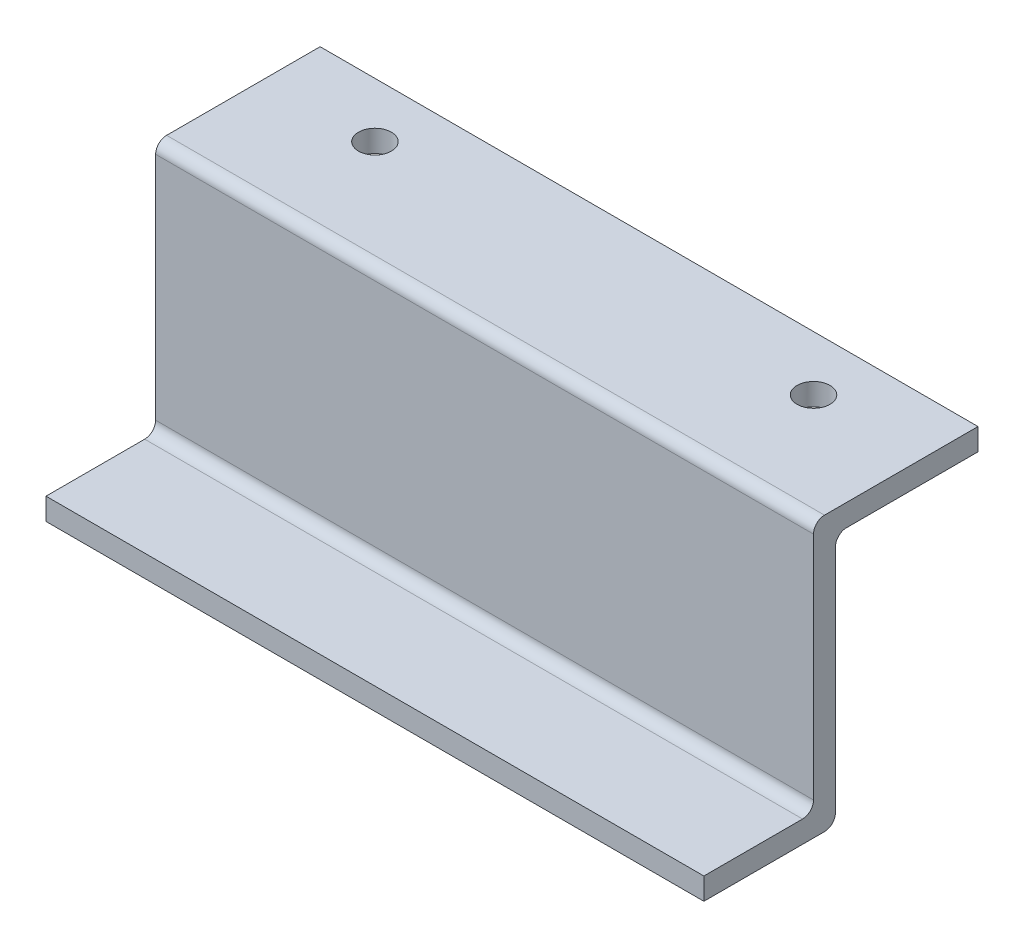
ISO-10303-21;
HEADER;
FILE_DESCRIPTION(('STEP AP214'),'2;1');
FILE_NAME('part.step','',(''),(''),'','','');
FILE_SCHEMA(('AUTOMOTIVE_DESIGN { 1 0 10303 214 1 1 1 1 }'));
ENDSEC;
DATA;
#1=APPLICATION_CONTEXT('core data for automotive mechanical design processes');
#2=APPLICATION_PROTOCOL_DEFINITION('international standard','automotive_design',2000,#1);
#3=PRODUCT_CONTEXT('',#1,'mechanical');
#4=PRODUCT('Part','Part','',(#3));
#5=PRODUCT_RELATED_PRODUCT_CATEGORY('part','',(#4));
#6=PRODUCT_DEFINITION_FORMATION('','',#4);
#7=PRODUCT_DEFINITION_CONTEXT('part definition',#1,'design');
#8=PRODUCT_DEFINITION('design','',#6,#7);
#9=PRODUCT_DEFINITION_SHAPE('','',#8);
#10=(LENGTH_UNIT() NAMED_UNIT(*) SI_UNIT(.MILLI.,.METRE.));
#11=(NAMED_UNIT(*) PLANE_ANGLE_UNIT() SI_UNIT($,.RADIAN.));
#12=(NAMED_UNIT(*) SI_UNIT($,.STERADIAN.) SOLID_ANGLE_UNIT());
#13=UNCERTAINTY_MEASURE_WITH_UNIT(LENGTH_MEASURE(1.E-05),#10,'distance_accuracy_value','');
#14=(GEOMETRIC_REPRESENTATION_CONTEXT(3) GLOBAL_UNCERTAINTY_ASSIGNED_CONTEXT((#13)) GLOBAL_UNIT_ASSIGNED_CONTEXT((#10,
#11,#12)) REPRESENTATION_CONTEXT('',''));
#15=CARTESIAN_POINT('',(0.,0.,0.));
#16=DIRECTION('',(0.,0.,1.));
#17=DIRECTION('',(1.,0.,0.));
#18=AXIS2_PLACEMENT_3D('',#15,#16,#17);
#19=CARTESIAN_POINT('',(60.,0.,-25.));
#20=DIRECTION('',(0.,0.,-1.));
#21=DIRECTION('',(-1.,0.,0.));
#22=AXIS2_PLACEMENT_3D('',#19,#20,#21);
#23=PLANE('',#22);
#24=DIRECTION('',(0.,-1.,0.));
#25=VECTOR('',#24,1.);
#26=CARTESIAN_POINT('',(0.,0.,-25.));
#27=LINE('',#26,#25);
#28=CARTESIAN_POINT('',(0.,25.,-25.));
#29=VERTEX_POINT('',#28);
#30=CARTESIAN_POINT('',(0.,23.,-25.));
#31=VERTEX_POINT('',#30);
#32=EDGE_CURVE('E143',#29,#31,#27,.T.);
#33=ORIENTED_EDGE('',*,*,#32,.F.);
#34=DIRECTION('',(-1.,0.,0.));
#35=VECTOR('',#34,1.);
#36=CARTESIAN_POINT('',(60.,25.,-25.));
#37=LINE('',#36,#35);
#38=CARTESIAN_POINT('',(60.,25.,-25.));
#39=VERTEX_POINT('',#38);
#40=EDGE_CURVE('E131',#39,#29,#37,.T.);
#41=ORIENTED_EDGE('',*,*,#40,.F.);
#42=DIRECTION('',(0.,-1.,0.));
#43=VECTOR('',#42,1.);
#44=CARTESIAN_POINT('',(60.,0.,-25.));
#45=LINE('',#44,#43);
#46=CARTESIAN_POINT('',(60.,23.,-25.));
#47=VERTEX_POINT('',#46);
#48=EDGE_CURVE('E138',#39,#47,#45,.T.);
#49=ORIENTED_EDGE('',*,*,#48,.T.);
#50=DIRECTION('',(-1.,0.,0.));
#51=VECTOR('',#50,1.);
#52=CARTESIAN_POINT('',(60.,23.,-25.));
#53=LINE('',#52,#51);
#54=EDGE_CURVE('E171',#47,#31,#53,.T.);
#55=ORIENTED_EDGE('',*,*,#54,.T.);
#56=EDGE_LOOP('',(#33,#41,#49,#55));
#57=FACE_BOUND('',#56,.T.);
#58=ADVANCED_FACE('F35',(#57),#23,.T.);
#59=CARTESIAN_POINT('',(60.,25.,0.));
#60=DIRECTION('',(0.,1.,0.));
#61=DIRECTION('',(0.,0.,1.));
#62=AXIS2_PLACEMENT_3D('',#59,#60,#61);
#63=PLANE('',#62);
#64=CARTESIAN_POINT('',(10.,25.,-20.));
#65=DIRECTION('',(0.,1.,0.));
#66=DIRECTION('',(0.,0.,1.));
#67=AXIS2_PLACEMENT_3D('',#64,#65,#66);
#68=CIRCLE('',#67,1.5);
#69=CARTESIAN_POINT('',(10.,25.,-18.5));
#70=VERTEX_POINT('',#69);
#71=EDGE_CURVE('E223',#70,#70,#68,.T.);
#72=ORIENTED_EDGE('',*,*,#71,.F.);
#73=EDGE_LOOP('',(#72));
#74=FACE_BOUND('',#73,.T.);
#75=CARTESIAN_POINT('',(50.,25.,-20.));
#76=DIRECTION('',(0.,1.,0.));
#77=DIRECTION('',(0.,0.,1.));
#78=AXIS2_PLACEMENT_3D('',#75,#76,#77);
#79=CIRCLE('',#78,1.5);
#80=CARTESIAN_POINT('',(50.,25.,-18.5));
#81=VERTEX_POINT('',#80);
#82=EDGE_CURVE('E155',#81,#81,#79,.T.);
#83=ORIENTED_EDGE('',*,*,#82,.F.);
#84=EDGE_LOOP('',(#83));
#85=FACE_BOUND('',#84,.T.);
#86=DIRECTION('',(0.,0.,-1.));
#87=VECTOR('',#86,1.);
#88=CARTESIAN_POINT('',(0.,25.,0.));
#89=LINE('',#88,#87);
#90=CARTESIAN_POINT('',(0.,25.,-11.));
#91=VERTEX_POINT('',#90);
#92=EDGE_CURVE('E173',#91,#29,#89,.T.);
#93=ORIENTED_EDGE('',*,*,#92,.F.);
#94=DIRECTION('',(-1.,0.,0.));
#95=VECTOR('',#94,1.);
#96=CARTESIAN_POINT('',(60.,25.,-11.));
#97=LINE('',#96,#95);
#98=CARTESIAN_POINT('',(60.,25.,-11.));
#99=VERTEX_POINT('',#98);
#100=EDGE_CURVE('E134',#91,#99,#97,.F.);
#101=ORIENTED_EDGE('',*,*,#100,.T.);
#102=DIRECTION('',(0.,0.,-1.));
#103=VECTOR('',#102,1.);
#104=CARTESIAN_POINT('',(60.,25.,0.));
#105=LINE('',#104,#103);
#106=EDGE_CURVE('E127',#99,#39,#105,.T.);
#107=ORIENTED_EDGE('',*,*,#106,.T.);
#108=ORIENTED_EDGE('',*,*,#40,.T.);
#109=EDGE_LOOP('',(#93,#101,#107,#108));
#110=FACE_BOUND('',#109,.T.);
#111=ADVANCED_FACE('F130',(#74,#85,#110),#63,.T.);
#112=CARTESIAN_POINT('',(60.,0.,-10.));
#113=DIRECTION('',(0.,0.,1.));
#114=DIRECTION('',(1.,0.,0.));
#115=AXIS2_PLACEMENT_3D('',#112,#113,#114);
#116=PLANE('',#115);
#117=DIRECTION('',(0.,1.,0.));
#118=VECTOR('',#117,1.);
#119=CARTESIAN_POINT('',(60.,0.,-10.));
#120=LINE('',#119,#118);
#121=CARTESIAN_POINT('',(60.,3.,-10.));
#122=VERTEX_POINT('',#121);
#123=CARTESIAN_POINT('',(60.,24.,-10.));
#124=VERTEX_POINT('',#123);
#125=EDGE_CURVE('E137',#122,#124,#120,.T.);
#126=ORIENTED_EDGE('',*,*,#125,.T.);
#127=DIRECTION('',(-1.,0.,0.));
#128=VECTOR('',#127,1.);
#129=CARTESIAN_POINT('',(60.,24.,-10.));
#130=LINE('',#129,#128);
#131=CARTESIAN_POINT('',(0.,24.,-10.));
#132=VERTEX_POINT('',#131);
#133=EDGE_CURVE('E194',#124,#132,#130,.T.);
#134=ORIENTED_EDGE('',*,*,#133,.T.);
#135=DIRECTION('',(0.,1.,0.));
#136=VECTOR('',#135,1.);
#137=CARTESIAN_POINT('',(0.,0.,-10.));
#138=LINE('',#137,#136);
#139=CARTESIAN_POINT('',(0.,3.,-10.));
#140=VERTEX_POINT('',#139);
#141=EDGE_CURVE('E175',#140,#132,#138,.T.);
#142=ORIENTED_EDGE('',*,*,#141,.F.);
#143=DIRECTION('',(-1.,0.,0.));
#144=VECTOR('',#143,1.);
#145=CARTESIAN_POINT('',(60.,3.,-10.));
#146=LINE('',#145,#144);
#147=EDGE_CURVE('E144',#140,#122,#146,.F.);
#148=ORIENTED_EDGE('',*,*,#147,.T.);
#149=EDGE_LOOP('',(#126,#134,#142,#148));
#150=FACE_BOUND('',#149,.T.);
#151=ADVANCED_FACE('F236',(#150),#116,.T.);
#152=CARTESIAN_POINT('',(60.,2.,0.));
#153=DIRECTION('',(0.,1.,0.));
#154=DIRECTION('',(0.,0.,1.));
#155=AXIS2_PLACEMENT_3D('',#152,#153,#154);
#156=PLANE('',#155);
#157=DIRECTION('',(0.,0.,-1.));
#158=VECTOR('',#157,1.);
#159=CARTESIAN_POINT('',(60.,2.,0.));
#160=LINE('',#159,#158);
#161=CARTESIAN_POINT('',(60.,2.,0.));
#162=VERTEX_POINT('',#161);
#163=CARTESIAN_POINT('',(60.,2.,-9.));
#164=VERTEX_POINT('',#163);
#165=EDGE_CURVE('E160',#162,#164,#160,.T.);
#166=ORIENTED_EDGE('',*,*,#165,.T.);
#167=DIRECTION('',(-1.,0.,0.));
#168=VECTOR('',#167,1.);
#169=CARTESIAN_POINT('',(0.,2.,-9.));
#170=LINE('',#169,#168);
#171=CARTESIAN_POINT('',(0.,2.,-9.));
#172=VERTEX_POINT('',#171);
#173=EDGE_CURVE('E215',#164,#172,#170,.T.);
#174=ORIENTED_EDGE('',*,*,#173,.T.);
#175=DIRECTION('',(0.,0.,-1.));
#176=VECTOR('',#175,1.);
#177=CARTESIAN_POINT('',(0.,2.,0.));
#178=LINE('',#177,#176);
#179=CARTESIAN_POINT('',(0.,2.,0.));
#180=VERTEX_POINT('',#179);
#181=EDGE_CURVE('E178',#180,#172,#178,.T.);
#182=ORIENTED_EDGE('',*,*,#181,.F.);
#183=DIRECTION('',(-1.,0.,0.));
#184=VECTOR('',#183,1.);
#185=CARTESIAN_POINT('',(60.,2.,0.));
#186=LINE('',#185,#184);
#187=EDGE_CURVE('E145',#162,#180,#186,.T.);
#188=ORIENTED_EDGE('',*,*,#187,.F.);
#189=EDGE_LOOP('',(#166,#174,#182,#188));
#190=FACE_BOUND('',#189,.T.);
#191=ADVANCED_FACE('F243',(#190),#156,.T.);
#192=CARTESIAN_POINT('',(60.,0.,0.));
#193=DIRECTION('',(0.,0.,1.));
#194=DIRECTION('',(1.,0.,0.));
#195=AXIS2_PLACEMENT_3D('',#192,#193,#194);
#196=PLANE('',#195);
#197=DIRECTION('',(0.,1.,0.));
#198=VECTOR('',#197,1.);
#199=CARTESIAN_POINT('',(0.,0.,0.));
#200=LINE('',#199,#198);
#201=CARTESIAN_POINT('',(0.,0.,0.));
#202=VERTEX_POINT('',#201);
#203=EDGE_CURVE('E181',#202,#180,#200,.T.);
#204=ORIENTED_EDGE('',*,*,#203,.F.);
#205=DIRECTION('',(-1.,0.,0.));
#206=VECTOR('',#205,1.);
#207=CARTESIAN_POINT('',(60.,0.,0.));
#208=LINE('',#207,#206);
#209=CARTESIAN_POINT('',(60.,0.,0.));
#210=VERTEX_POINT('',#209);
#211=EDGE_CURVE('E190',#210,#202,#208,.T.);
#212=ORIENTED_EDGE('',*,*,#211,.F.);
#213=DIRECTION('',(0.,1.,0.));
#214=VECTOR('',#213,1.);
#215=CARTESIAN_POINT('',(60.,0.,0.));
#216=LINE('',#215,#214);
#217=EDGE_CURVE('E163',#210,#162,#216,.T.);
#218=ORIENTED_EDGE('',*,*,#217,.T.);
#219=ORIENTED_EDGE('',*,*,#187,.T.);
#220=EDGE_LOOP('',(#204,#212,#218,#219));
#221=FACE_BOUND('',#220,.T.);
#222=ADVANCED_FACE('F288',(#221),#196,.T.);
#223=CARTESIAN_POINT('',(60.,0.,0.));
#224=DIRECTION('',(0.,1.,0.));
#225=DIRECTION('',(0.,0.,1.));
#226=AXIS2_PLACEMENT_3D('',#223,#224,#225);
#227=PLANE('',#226);
#228=DIRECTION('',(0.,0.,-1.));
#229=VECTOR('',#228,1.);
#230=CARTESIAN_POINT('',(0.,0.,0.));
#231=LINE('',#230,#229);
#232=CARTESIAN_POINT('',(0.,0.,-11.));
#233=VERTEX_POINT('',#232);
#234=EDGE_CURVE('E184',#202,#233,#231,.T.);
#235=ORIENTED_EDGE('',*,*,#234,.T.);
#236=DIRECTION('',(-1.,0.,0.));
#237=VECTOR('',#236,1.);
#238=CARTESIAN_POINT('',(60.,0.,-11.));
#239=LINE('',#238,#237);
#240=CARTESIAN_POINT('',(60.,0.,-11.));
#241=VERTEX_POINT('',#240);
#242=EDGE_CURVE('E213',#233,#241,#239,.F.);
#243=ORIENTED_EDGE('',*,*,#242,.T.);
#244=DIRECTION('',(0.,0.,-1.));
#245=VECTOR('',#244,1.);
#246=CARTESIAN_POINT('',(60.,0.,0.));
#247=LINE('',#246,#245);
#248=EDGE_CURVE('E166',#210,#241,#247,.T.);
#249=ORIENTED_EDGE('',*,*,#248,.F.);
#250=ORIENTED_EDGE('',*,*,#211,.T.);
#251=EDGE_LOOP('',(#235,#243,#249,#250));
#252=FACE_BOUND('',#251,.T.);
#253=ADVANCED_FACE('F291',(#252),#227,.F.);
#254=CARTESIAN_POINT('',(60.,0.,-12.));
#255=DIRECTION('',(0.,0.,-1.));
#256=DIRECTION('',(-1.,0.,0.));
#257=AXIS2_PLACEMENT_3D('',#254,#255,#256);
#258=PLANE('',#257);
#259=DIRECTION('',(0.,-1.,0.));
#260=VECTOR('',#259,1.);
#261=CARTESIAN_POINT('',(0.,0.,-12.));
#262=LINE('',#261,#260);
#263=CARTESIAN_POINT('',(0.,22.,-12.));
#264=VERTEX_POINT('',#263);
#265=CARTESIAN_POINT('',(0.,1.,-12.));
#266=VERTEX_POINT('',#265);
#267=EDGE_CURVE('E152',#264,#266,#262,.T.);
#268=ORIENTED_EDGE('',*,*,#267,.F.);
#269=DIRECTION('',(-1.,0.,0.));
#270=VECTOR('',#269,1.);
#271=CARTESIAN_POINT('',(60.,22.,-12.));
#272=LINE('',#271,#270);
#273=CARTESIAN_POINT('',(60.,22.,-12.));
#274=VERTEX_POINT('',#273);
#275=EDGE_CURVE('E211',#264,#274,#272,.F.);
#276=ORIENTED_EDGE('',*,*,#275,.T.);
#277=DIRECTION('',(0.,-1.,0.));
#278=VECTOR('',#277,1.);
#279=CARTESIAN_POINT('',(60.,0.,-12.));
#280=LINE('',#279,#278);
#281=CARTESIAN_POINT('',(60.,1.,-12.));
#282=VERTEX_POINT('',#281);
#283=EDGE_CURVE('E168',#274,#282,#280,.T.);
#284=ORIENTED_EDGE('',*,*,#283,.T.);
#285=DIRECTION('',(-1.,0.,0.));
#286=VECTOR('',#285,1.);
#287=CARTESIAN_POINT('',(0.,1.,-12.));
#288=LINE('',#287,#286);
#289=EDGE_CURVE('E208',#282,#266,#288,.T.);
#290=ORIENTED_EDGE('',*,*,#289,.T.);
#291=EDGE_LOOP('',(#268,#276,#284,#290));
#292=FACE_BOUND('',#291,.T.);
#293=ADVANCED_FACE('F268',(#292),#258,.T.);
#294=CARTESIAN_POINT('',(60.,23.,0.));
#295=DIRECTION('',(0.,-1.,0.));
#296=DIRECTION('',(0.,0.,-1.));
#297=AXIS2_PLACEMENT_3D('',#294,#295,#296);
#298=PLANE('',#297);
#299=CARTESIAN_POINT('',(10.,23.,-20.));
#300=DIRECTION('',(0.,-1.,0.));
#301=DIRECTION('',(0.,0.,-1.));
#302=AXIS2_PLACEMENT_3D('',#299,#300,#301);
#303=CIRCLE('',#302,1.5);
#304=CARTESIAN_POINT('',(10.,23.,-21.5));
#305=VERTEX_POINT('',#304);
#306=EDGE_CURVE('E39',#305,#305,#303,.T.);
#307=ORIENTED_EDGE('',*,*,#306,.F.);
#308=EDGE_LOOP('',(#307));
#309=FACE_BOUND('',#308,.T.);
#310=CARTESIAN_POINT('',(50.,23.,-20.));
#311=DIRECTION('',(0.,-1.,0.));
#312=DIRECTION('',(0.,0.,-1.));
#313=AXIS2_PLACEMENT_3D('',#310,#311,#312);
#314=CIRCLE('',#313,1.5);
#315=CARTESIAN_POINT('',(50.,23.,-21.5));
#316=VERTEX_POINT('',#315);
#317=EDGE_CURVE('E221',#316,#316,#314,.T.);
#318=ORIENTED_EDGE('',*,*,#317,.F.);
#319=EDGE_LOOP('',(#318));
#320=FACE_BOUND('',#319,.T.);
#321=DIRECTION('',(0.,0.,1.));
#322=VECTOR('',#321,1.);
#323=CARTESIAN_POINT('',(60.,23.,0.));
#324=LINE('',#323,#322);
#325=CARTESIAN_POINT('',(60.,23.,-13.));
#326=VERTEX_POINT('',#325);
#327=EDGE_CURVE('E148',#47,#326,#324,.T.);
#328=ORIENTED_EDGE('',*,*,#327,.T.);
#329=DIRECTION('',(-1.,0.,0.));
#330=VECTOR('',#329,1.);
#331=CARTESIAN_POINT('',(0.,23.,-13.));
#332=LINE('',#331,#330);
#333=CARTESIAN_POINT('',(0.,23.,-13.));
#334=VERTEX_POINT('',#333);
#335=EDGE_CURVE('E205',#326,#334,#332,.T.);
#336=ORIENTED_EDGE('',*,*,#335,.T.);
#337=DIRECTION('',(0.,0.,1.));
#338=VECTOR('',#337,1.);
#339=CARTESIAN_POINT('',(0.,23.,0.));
#340=LINE('',#339,#338);
#341=EDGE_CURVE('E149',#31,#334,#340,.T.);
#342=ORIENTED_EDGE('',*,*,#341,.F.);
#343=ORIENTED_EDGE('',*,*,#54,.F.);
#344=EDGE_LOOP('',(#328,#336,#342,#343));
#345=FACE_BOUND('',#344,.T.);
#346=ADVANCED_FACE('F275',(#309,#320,#345),#298,.T.);
#347=CARTESIAN_POINT('',(60.,0.,0.));
#348=DIRECTION('',(1.,0.,0.));
#349=DIRECTION('',(0.,0.,-1.));
#350=AXIS2_PLACEMENT_3D('',#347,#348,#349);
#351=PLANE('',#350);
#352=ORIENTED_EDGE('',*,*,#106,.F.);
#353=CARTESIAN_POINT('',(60.,24.,-11.));
#354=DIRECTION('',(1.,0.,0.));
#355=DIRECTION('',(0.,0.,-1.));
#356=AXIS2_PLACEMENT_3D('',#353,#354,#355);
#357=CIRCLE('',#356,1.);
#358=EDGE_CURVE('E203',#99,#124,#357,.T.);
#359=ORIENTED_EDGE('',*,*,#358,.T.);
#360=ORIENTED_EDGE('',*,*,#125,.F.);
#361=CARTESIAN_POINT('',(60.,3.,-9.));
#362=DIRECTION('',(1.,0.,0.));
#363=DIRECTION('',(0.,0.,-1.));
#364=AXIS2_PLACEMENT_3D('',#361,#362,#363);
#365=CIRCLE('',#364,1.);
#366=EDGE_CURVE('E11',#122,#164,#365,.F.);
#367=ORIENTED_EDGE('',*,*,#366,.T.);
#368=ORIENTED_EDGE('',*,*,#165,.F.);
#369=ORIENTED_EDGE('',*,*,#217,.F.);
#370=ORIENTED_EDGE('',*,*,#248,.T.);
#371=CARTESIAN_POINT('',(60.,1.,-11.));
#372=DIRECTION('',(1.,0.,0.));
#373=DIRECTION('',(0.,0.,-1.));
#374=AXIS2_PLACEMENT_3D('',#371,#372,#373);
#375=CIRCLE('',#374,1.);
#376=EDGE_CURVE('E58',#241,#282,#375,.T.);
#377=ORIENTED_EDGE('',*,*,#376,.T.);
#378=ORIENTED_EDGE('',*,*,#283,.F.);
#379=CARTESIAN_POINT('',(60.,22.,-13.));
#380=DIRECTION('',(1.,0.,0.));
#381=DIRECTION('',(0.,0.,-1.));
#382=AXIS2_PLACEMENT_3D('',#379,#380,#381);
#383=CIRCLE('',#382,1.);
#384=EDGE_CURVE('E52',#274,#326,#383,.F.);
#385=ORIENTED_EDGE('',*,*,#384,.T.);
#386=ORIENTED_EDGE('',*,*,#327,.F.);
#387=ORIENTED_EDGE('',*,*,#48,.F.);
#388=EDGE_LOOP('',(#352,#359,#360,#367,#368,#369,#370,#377,#378,#385,#386,#387));
#389=FACE_BOUND('',#388,.T.);
#390=ADVANCED_FACE('F147',(#389),#351,.T.);
#391=CARTESIAN_POINT('',(0.,0.,0.));
#392=DIRECTION('',(1.,0.,0.));
#393=DIRECTION('',(0.,0.,-1.));
#394=AXIS2_PLACEMENT_3D('',#391,#392,#393);
#395=PLANE('',#394);
#396=ORIENTED_EDGE('',*,*,#141,.T.);
#397=CARTESIAN_POINT('',(0.,24.,-11.));
#398=DIRECTION('',(1.,0.,0.));
#399=DIRECTION('',(0.,0.,-1.));
#400=AXIS2_PLACEMENT_3D('',#397,#398,#399);
#401=CIRCLE('',#400,1.);
#402=EDGE_CURVE('E199',#132,#91,#401,.F.);
#403=ORIENTED_EDGE('',*,*,#402,.T.);
#404=ORIENTED_EDGE('',*,*,#92,.T.);
#405=ORIENTED_EDGE('',*,*,#32,.T.);
#406=ORIENTED_EDGE('',*,*,#341,.T.);
#407=CARTESIAN_POINT('',(0.,22.,-13.));
#408=DIRECTION('',(1.,0.,0.));
#409=DIRECTION('',(0.,0.,-1.));
#410=AXIS2_PLACEMENT_3D('',#407,#408,#409);
#411=CIRCLE('',#410,1.);
#412=EDGE_CURVE('E218',#334,#264,#411,.T.);
#413=ORIENTED_EDGE('',*,*,#412,.T.);
#414=ORIENTED_EDGE('',*,*,#267,.T.);
#415=CARTESIAN_POINT('',(0.,1.,-11.));
#416=DIRECTION('',(1.,0.,0.));
#417=DIRECTION('',(0.,0.,-1.));
#418=AXIS2_PLACEMENT_3D('',#415,#416,#417);
#419=CIRCLE('',#418,1.);
#420=EDGE_CURVE('E197',#266,#233,#419,.F.);
#421=ORIENTED_EDGE('',*,*,#420,.T.);
#422=ORIENTED_EDGE('',*,*,#234,.F.);
#423=ORIENTED_EDGE('',*,*,#203,.T.);
#424=ORIENTED_EDGE('',*,*,#181,.T.);
#425=CARTESIAN_POINT('',(0.,3.,-9.));
#426=DIRECTION('',(1.,0.,0.));
#427=DIRECTION('',(0.,0.,-1.));
#428=AXIS2_PLACEMENT_3D('',#425,#426,#427);
#429=CIRCLE('',#428,1.);
#430=EDGE_CURVE('E44',#172,#140,#429,.T.);
#431=ORIENTED_EDGE('',*,*,#430,.T.);
#432=EDGE_LOOP('',(#396,#403,#404,#405,#406,#413,#414,#421,#422,#423,#424,#431));
#433=FACE_BOUND('',#432,.T.);
#434=ADVANCED_FACE('F253',(#433),#395,.F.);
#435=CARTESIAN_POINT('',(60.,24.,-11.));
#436=DIRECTION('',(-1.,0.,0.));
#437=DIRECTION('',(0.,0.,1.));
#438=AXIS2_PLACEMENT_3D('',#435,#436,#437);
#439=CYLINDRICAL_SURFACE('',#438,1.);
#440=ORIENTED_EDGE('',*,*,#358,.F.);
#441=ORIENTED_EDGE('',*,*,#100,.F.);
#442=ORIENTED_EDGE('',*,*,#402,.F.);
#443=ORIENTED_EDGE('',*,*,#133,.F.);
#444=EDGE_LOOP('',(#440,#441,#442,#443));
#445=FACE_BOUND('',#444,.T.);
#446=ADVANCED_FACE('F249',(#445),#439,.T.);
#447=CARTESIAN_POINT('',(60.,22.,-13.));
#448=DIRECTION('',(1.,0.,0.));
#449=DIRECTION('',(0.,0.,-1.));
#450=AXIS2_PLACEMENT_3D('',#447,#448,#449);
#451=CYLINDRICAL_SURFACE('',#450,1.);
#452=ORIENTED_EDGE('',*,*,#384,.F.);
#453=ORIENTED_EDGE('',*,*,#275,.F.);
#454=ORIENTED_EDGE('',*,*,#412,.F.);
#455=ORIENTED_EDGE('',*,*,#335,.F.);
#456=EDGE_LOOP('',(#452,#453,#454,#455));
#457=FACE_BOUND('',#456,.T.);
#458=ADVANCED_FACE('F252',(#457),#451,.F.);
#459=CARTESIAN_POINT('',(60.,1.,-11.));
#460=DIRECTION('',(1.,0.,0.));
#461=DIRECTION('',(0.,0.,-1.));
#462=AXIS2_PLACEMENT_3D('',#459,#460,#461);
#463=CYLINDRICAL_SURFACE('',#462,1.);
#464=ORIENTED_EDGE('',*,*,#376,.F.);
#465=ORIENTED_EDGE('',*,*,#242,.F.);
#466=ORIENTED_EDGE('',*,*,#420,.F.);
#467=ORIENTED_EDGE('',*,*,#289,.F.);
#468=EDGE_LOOP('',(#464,#465,#466,#467));
#469=FACE_BOUND('',#468,.T.);
#470=ADVANCED_FACE('F256',(#469),#463,.T.);
#471=CARTESIAN_POINT('',(60.,3.,-9.));
#472=DIRECTION('',(1.,0.,0.));
#473=DIRECTION('',(0.,0.,-1.));
#474=AXIS2_PLACEMENT_3D('',#471,#472,#473);
#475=CYLINDRICAL_SURFACE('',#474,1.);
#476=ORIENTED_EDGE('',*,*,#366,.F.);
#477=ORIENTED_EDGE('',*,*,#147,.F.);
#478=ORIENTED_EDGE('',*,*,#430,.F.);
#479=ORIENTED_EDGE('',*,*,#173,.F.);
#480=EDGE_LOOP('',(#476,#477,#478,#479));
#481=FACE_BOUND('',#480,.T.);
#482=ADVANCED_FACE('F37',(#481),#475,.F.);
#483=CARTESIAN_POINT('',(50.,-15.,-20.));
#484=DIRECTION('',(0.,1.,0.));
#485=DIRECTION('',(0.,0.,1.));
#486=AXIS2_PLACEMENT_3D('',#483,#484,#485);
#487=CYLINDRICAL_SURFACE('',#486,1.5);
#488=ORIENTED_EDGE('',*,*,#317,.T.);
#489=EDGE_LOOP('',(#488));
#490=FACE_BOUND('',#489,.T.);
#491=ORIENTED_EDGE('',*,*,#82,.T.);
#492=EDGE_LOOP('',(#491));
#493=FACE_BOUND('',#492,.T.);
#494=ADVANCED_FACE('F233',(#490,#493),#487,.F.);
#495=CARTESIAN_POINT('',(10.,-15.,-20.));
#496=DIRECTION('',(0.,1.,0.));
#497=DIRECTION('',(0.,0.,1.));
#498=AXIS2_PLACEMENT_3D('',#495,#496,#497);
#499=CYLINDRICAL_SURFACE('',#498,1.5);
#500=ORIENTED_EDGE('',*,*,#306,.T.);
#501=EDGE_LOOP('',(#500));
#502=FACE_BOUND('',#501,.T.);
#503=ORIENTED_EDGE('',*,*,#71,.T.);
#504=EDGE_LOOP('',(#503));
#505=FACE_BOUND('',#504,.T.);
#506=ADVANCED_FACE('F354',(#502,#505),#499,.F.);
#507=CLOSED_SHELL('',(#58,#111,#151,#191,#222,#253,#293,#346,#390,#434,#446,#458,#470,#482,#494,#506));
#508=MANIFOLD_SOLID_BREP('B2',#507);
#509=ADVANCED_BREP_SHAPE_REPRESENTATION('',(#18,#508),#14);
#510=SHAPE_DEFINITION_REPRESENTATION(#9,#509);
ENDSEC;
END-ISO-10303-21;
